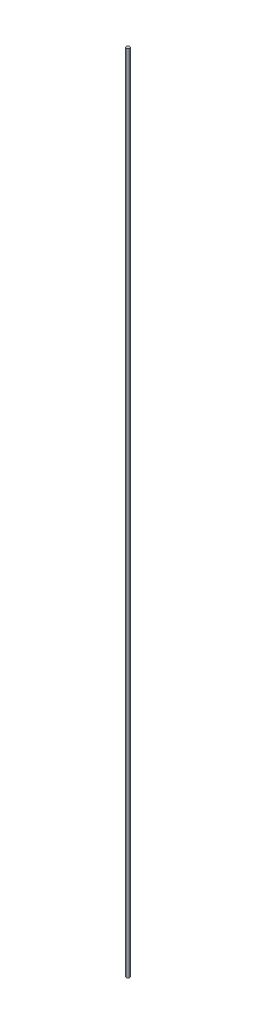
ISO-10303-21;
HEADER;
FILE_DESCRIPTION(('STEP AP214'),'2;1');
FILE_NAME('part.step','',(''),(''),'','','');
FILE_SCHEMA(('AUTOMOTIVE_DESIGN { 1 0 10303 214 1 1 1 1 }'));
ENDSEC;
DATA;
#1=APPLICATION_CONTEXT('core data for automotive mechanical design processes');
#2=APPLICATION_PROTOCOL_DEFINITION('international standard','automotive_design',2000,#1);
#3=PRODUCT_CONTEXT('',#1,'mechanical');
#4=PRODUCT('Part','Part','',(#3));
#5=PRODUCT_RELATED_PRODUCT_CATEGORY('part','',(#4));
#6=PRODUCT_DEFINITION_FORMATION('','',#4);
#7=PRODUCT_DEFINITION_CONTEXT('part definition',#1,'design');
#8=PRODUCT_DEFINITION('design','',#6,#7);
#9=PRODUCT_DEFINITION_SHAPE('','',#8);
#10=(LENGTH_UNIT() NAMED_UNIT(*) SI_UNIT(.MILLI.,.METRE.));
#11=(NAMED_UNIT(*) PLANE_ANGLE_UNIT() SI_UNIT($,.RADIAN.));
#12=(NAMED_UNIT(*) SI_UNIT($,.STERADIAN.) SOLID_ANGLE_UNIT());
#13=UNCERTAINTY_MEASURE_WITH_UNIT(LENGTH_MEASURE(1.E-05),#10,'distance_accuracy_value','');
#14=(GEOMETRIC_REPRESENTATION_CONTEXT(3) GLOBAL_UNCERTAINTY_ASSIGNED_CONTEXT((#13)) GLOBAL_UNIT_ASSIGNED_CONTEXT((#10,
#11,#12)) REPRESENTATION_CONTEXT('',''));
#15=CARTESIAN_POINT('',(0.,0.,0.));
#16=DIRECTION('',(0.,0.,1.));
#17=DIRECTION('',(1.,0.,0.));
#18=AXIS2_PLACEMENT_3D('',#15,#16,#17);
#19=CARTESIAN_POINT('',(0.,381.,0.));
#20=DIRECTION('',(0.,-1.,0.));
#21=DIRECTION('',(0.,0.,-1.));
#22=AXIS2_PLACEMENT_3D('',#19,#20,#21);
#23=CYLINDRICAL_SURFACE('',#22,0.762);
#24=CARTESIAN_POINT('',(0.,381.,0.));
#25=DIRECTION('',(0.,1.,0.));
#26=DIRECTION('',(0.,0.,1.));
#27=AXIS2_PLACEMENT_3D('',#24,#25,#26);
#28=CIRCLE('',#27,0.762);
#29=CARTESIAN_POINT('',(0.,381.,0.762));
#30=VERTEX_POINT('',#29);
#31=EDGE_CURVE('E10',#30,#30,#28,.T.);
#32=ORIENTED_EDGE('',*,*,#31,.F.);
#33=EDGE_LOOP('',(#32));
#34=FACE_BOUND('',#33,.T.);
#35=CARTESIAN_POINT('',(0.,0.,0.));
#36=DIRECTION('',(0.,1.,0.));
#37=DIRECTION('',(0.,0.,1.));
#38=AXIS2_PLACEMENT_3D('',#35,#36,#37);
#39=CIRCLE('',#38,0.762);
#40=CARTESIAN_POINT('',(0.,0.,0.762));
#41=VERTEX_POINT('',#40);
#42=EDGE_CURVE('E46',#41,#41,#39,.T.);
#43=ORIENTED_EDGE('',*,*,#42,.T.);
#44=EDGE_LOOP('',(#43));
#45=FACE_BOUND('',#44,.T.);
#46=ADVANCED_FACE('F43',(#34,#45),#23,.T.);
#47=CARTESIAN_POINT('',(0.,381.,0.));
#48=DIRECTION('',(0.,1.,0.));
#49=DIRECTION('',(0.,0.,1.));
#50=AXIS2_PLACEMENT_3D('',#47,#48,#49);
#51=PLANE('',#50);
#52=ORIENTED_EDGE('',*,*,#31,.T.);
#53=EDGE_LOOP('',(#52));
#54=FACE_BOUND('',#53,.T.);
#55=ADVANCED_FACE('F60',(#54),#51,.T.);
#56=CARTESIAN_POINT('',(0.,0.,0.));
#57=DIRECTION('',(0.,1.,0.));
#58=DIRECTION('',(0.,0.,1.));
#59=AXIS2_PLACEMENT_3D('',#56,#57,#58);
#60=PLANE('',#59);
#61=ORIENTED_EDGE('',*,*,#42,.F.);
#62=EDGE_LOOP('',(#61));
#63=FACE_BOUND('',#62,.T.);
#64=ADVANCED_FACE('F58',(#63),#60,.F.);
#65=CLOSED_SHELL('',(#46,#55,#64));
#66=MANIFOLD_SOLID_BREP('B2',#65);
#67=ADVANCED_BREP_SHAPE_REPRESENTATION('',(#18,#66),#14);
#68=SHAPE_DEFINITION_REPRESENTATION(#9,#67);
ENDSEC;
END-ISO-10303-21;
